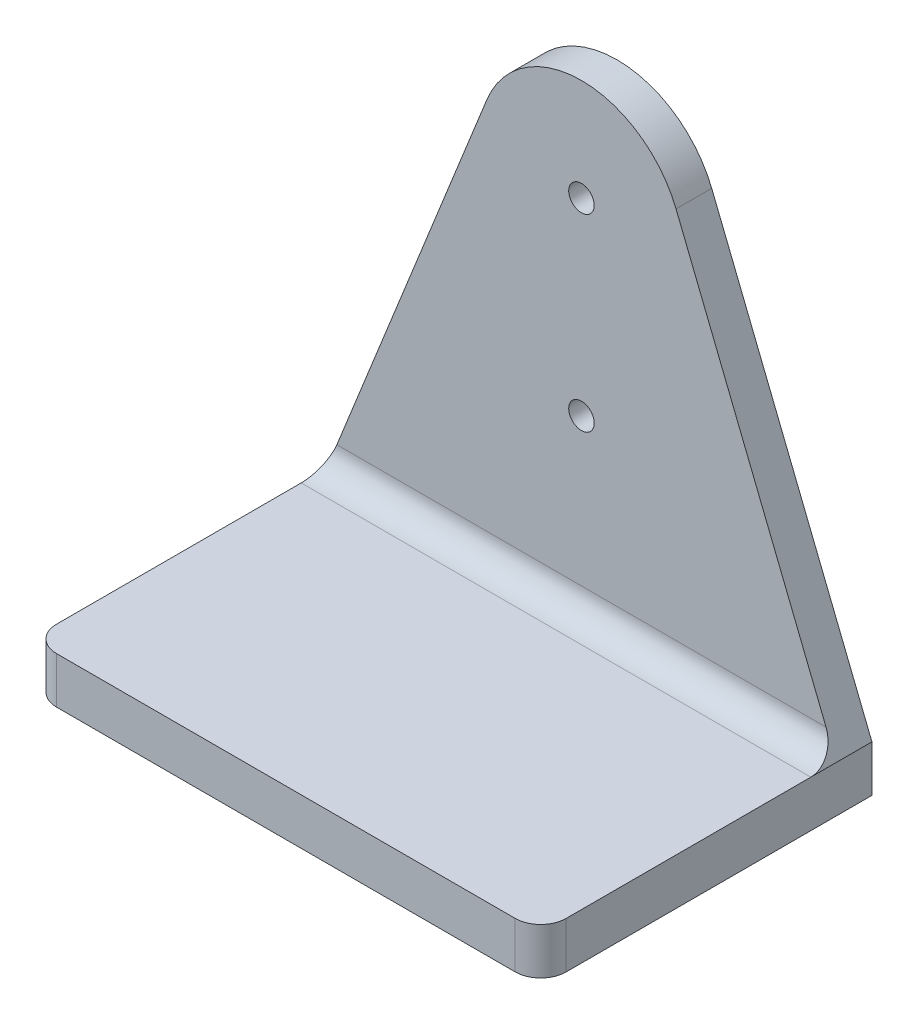
ISO-10303-21;
HEADER;
FILE_DESCRIPTION(('STEP AP214'),'2;1');
FILE_NAME('part.step','',(''),(''),'','','');
FILE_SCHEMA(('AUTOMOTIVE_DESIGN { 1 0 10303 214 1 1 1 1 }'));
ENDSEC;
DATA;
#1=APPLICATION_CONTEXT('core data for automotive mechanical design processes');
#2=APPLICATION_PROTOCOL_DEFINITION('international standard','automotive_design',2000,#1);
#3=PRODUCT_CONTEXT('',#1,'mechanical');
#4=PRODUCT('Part','Part','',(#3));
#5=PRODUCT_RELATED_PRODUCT_CATEGORY('part','',(#4));
#6=PRODUCT_DEFINITION_FORMATION('','',#4);
#7=PRODUCT_DEFINITION_CONTEXT('part definition',#1,'design');
#8=PRODUCT_DEFINITION('design','',#6,#7);
#9=PRODUCT_DEFINITION_SHAPE('','',#8);
#10=(LENGTH_UNIT() NAMED_UNIT(*) SI_UNIT(.MILLI.,.METRE.));
#11=(NAMED_UNIT(*) PLANE_ANGLE_UNIT() SI_UNIT($,.RADIAN.));
#12=(NAMED_UNIT(*) SI_UNIT($,.STERADIAN.) SOLID_ANGLE_UNIT());
#13=UNCERTAINTY_MEASURE_WITH_UNIT(LENGTH_MEASURE(1.E-05),#10,'distance_accuracy_value','');
#14=(GEOMETRIC_REPRESENTATION_CONTEXT(3) GLOBAL_UNCERTAINTY_ASSIGNED_CONTEXT((#13)) GLOBAL_UNIT_ASSIGNED_CONTEXT((#10,
#11,#12)) REPRESENTATION_CONTEXT('',''));
#15=CARTESIAN_POINT('',(0.,0.,0.));
#16=DIRECTION('',(0.,0.,1.));
#17=DIRECTION('',(1.,0.,0.));
#18=AXIS2_PLACEMENT_3D('',#15,#16,#17);
#19=CARTESIAN_POINT('',(50.,9.1,32.5));
#20=DIRECTION('',(0.,1.,0.));
#21=DIRECTION('',(0.,0.,1.));
#22=AXIS2_PLACEMENT_3D('',#19,#20,#21);
#23=PLANE('',#22);
#24=DIRECTION('',(0.,0.,1.));
#25=VECTOR('',#24,1.);
#26=CARTESIAN_POINT('',(-50.,9.1,-32.5));
#27=LINE('',#26,#25);
#28=CARTESIAN_POINT('',(-50.,9.1,-20.5));
#29=VERTEX_POINT('',#28);
#30=CARTESIAN_POINT('',(-50.,9.1,27.5));
#31=VERTEX_POINT('',#30);
#32=EDGE_CURVE('E161',#29,#31,#27,.T.);
#33=ORIENTED_EDGE('',*,*,#32,.T.);
#34=CARTESIAN_POINT('',(-45.,9.1,27.5));
#35=DIRECTION('',(0.,1.,0.));
#36=DIRECTION('',(0.,0.,1.));
#37=AXIS2_PLACEMENT_3D('',#34,#35,#36);
#38=CIRCLE('',#37,5.);
#39=CARTESIAN_POINT('',(-45.,9.1,32.5));
#40=VERTEX_POINT('',#39);
#41=EDGE_CURVE('E44',#31,#40,#38,.T.);
#42=ORIENTED_EDGE('',*,*,#41,.T.);
#43=DIRECTION('',(1.,0.,0.));
#44=VECTOR('',#43,1.);
#45=CARTESIAN_POINT('',(-50.,9.1,32.5));
#46=LINE('',#45,#44);
#47=CARTESIAN_POINT('',(45.,9.1,32.5));
#48=VERTEX_POINT('',#47);
#49=EDGE_CURVE('E166',#40,#48,#46,.T.);
#50=ORIENTED_EDGE('',*,*,#49,.T.);
#51=CARTESIAN_POINT('',(45.,9.1,27.5));
#52=DIRECTION('',(0.,1.,0.));
#53=DIRECTION('',(0.,0.,1.));
#54=AXIS2_PLACEMENT_3D('',#51,#52,#53);
#55=CIRCLE('',#54,5.);
#56=CARTESIAN_POINT('',(50.,9.1,27.5));
#57=VERTEX_POINT('',#56);
#58=EDGE_CURVE('E51',#48,#57,#55,.T.);
#59=ORIENTED_EDGE('',*,*,#58,.T.);
#60=DIRECTION('',(0.,0.,-1.));
#61=VECTOR('',#60,1.);
#62=CARTESIAN_POINT('',(50.,9.1,-32.5));
#63=LINE('',#62,#61);
#64=CARTESIAN_POINT('',(50.,9.1,-20.5));
#65=VERTEX_POINT('',#64);
#66=EDGE_CURVE('E158',#57,#65,#63,.T.);
#67=ORIENTED_EDGE('',*,*,#66,.T.);
#68=DIRECTION('',(-1.,0.,0.));
#69=VECTOR('',#68,1.);
#70=CARTESIAN_POINT('',(50.,9.1,-20.5));
#71=LINE('',#70,#69);
#72=EDGE_CURVE('E208',#65,#29,#71,.T.);
#73=ORIENTED_EDGE('',*,*,#72,.T.);
#74=EDGE_LOOP('',(#33,#42,#50,#59,#67,#73));
#75=FACE_BOUND('',#74,.T.);
#76=ADVANCED_FACE('F36',(#75),#23,.T.);
#77=CARTESIAN_POINT('',(50.,9.1,-32.5));
#78=DIRECTION('',(-1.,0.,0.));
#79=DIRECTION('',(0.,0.,1.));
#80=AXIS2_PLACEMENT_3D('',#77,#78,#79);
#81=PLANE('',#80);
#82=ORIENTED_EDGE('',*,*,#66,.F.);
#83=DIRECTION('',(0.,-1.,0.));
#84=VECTOR('',#83,1.);
#85=CARTESIAN_POINT('',(50.,9.1,27.5));
#86=LINE('',#85,#84);
#87=CARTESIAN_POINT('',(50.,0.,27.5));
#88=VERTEX_POINT('',#87);
#89=EDGE_CURVE('E11',#57,#88,#86,.T.);
#90=ORIENTED_EDGE('',*,*,#89,.T.);
#91=DIRECTION('',(0.,0.,-1.));
#92=VECTOR('',#91,1.);
#93=CARTESIAN_POINT('',(50.,0.,-32.5));
#94=LINE('',#93,#92);
#95=CARTESIAN_POINT('',(50.,0.,-32.5));
#96=VERTEX_POINT('',#95);
#97=EDGE_CURVE('E200',#88,#96,#94,.T.);
#98=ORIENTED_EDGE('',*,*,#97,.T.);
#99=DIRECTION('',(0.,-1.,0.));
#100=VECTOR('',#99,1.);
#101=CARTESIAN_POINT('',(50.,9.1,-32.5));
#102=LINE('',#101,#100);
#103=CARTESIAN_POINT('',(50.,9.1,-32.5));
#104=VERTEX_POINT('',#103);
#105=EDGE_CURVE('E205',#104,#96,#102,.T.);
#106=ORIENTED_EDGE('',*,*,#105,.F.);
#107=DIRECTION('',(0.,0.,-1.));
#108=VECTOR('',#107,1.);
#109=CARTESIAN_POINT('',(50.,9.1,-25.5));
#110=LINE('',#109,#108);
#111=EDGE_CURVE('E151',#65,#104,#110,.T.);
#112=ORIENTED_EDGE('',*,*,#111,.F.);
#113=EDGE_LOOP('',(#82,#90,#98,#106,#112));
#114=FACE_BOUND('',#113,.T.);
#115=ADVANCED_FACE('F235',(#114),#81,.F.);
#116=CARTESIAN_POINT('',(-50.,9.1,-32.5));
#117=DIRECTION('',(0.,0.,1.));
#118=DIRECTION('',(1.,0.,0.));
#119=AXIS2_PLACEMENT_3D('',#116,#117,#118);
#120=PLANE('',#119);
#121=CARTESIAN_POINT('',(0.,80.,-32.5));
#122=DIRECTION('',(0.,0.,1.));
#123=DIRECTION('',(1.,0.,0.));
#124=AXIS2_PLACEMENT_3D('',#121,#122,#123);
#125=CIRCLE('',#124,2.49999999999999);
#126=CARTESIAN_POINT('',(2.49999999999999,80.,-32.5));
#127=VERTEX_POINT('',#126);
#128=EDGE_CURVE('E377',#127,#127,#125,.T.);
#129=ORIENTED_EDGE('',*,*,#128,.T.);
#130=EDGE_LOOP('',(#129));
#131=FACE_BOUND('',#130,.T.);
#132=CARTESIAN_POINT('',(0.,43.,-32.5));
#133=DIRECTION('',(0.,0.,1.));
#134=DIRECTION('',(1.,0.,0.));
#135=AXIS2_PLACEMENT_3D('',#132,#133,#134);
#136=CIRCLE('',#135,2.49999999999999);
#137=CARTESIAN_POINT('',(2.49999999999999,43.,-32.5));
#138=VERTEX_POINT('',#137);
#139=EDGE_CURVE('E144',#138,#138,#136,.T.);
#140=ORIENTED_EDGE('',*,*,#139,.T.);
#141=EDGE_LOOP('',(#140));
#142=FACE_BOUND('',#141,.T.);
#143=DIRECTION('',(-1.,0.,0.));
#144=VECTOR('',#143,1.);
#145=CARTESIAN_POINT('',(-50.,0.,-32.5));
#146=LINE('',#145,#144);
#147=CARTESIAN_POINT('',(-50.,0.,-32.5));
#148=VERTEX_POINT('',#147);
#149=EDGE_CURVE('E197',#96,#148,#146,.T.);
#150=ORIENTED_EDGE('',*,*,#149,.T.);
#151=DIRECTION('',(0.,-1.,0.));
#152=VECTOR('',#151,1.);
#153=CARTESIAN_POINT('',(-50.,9.1,-32.5));
#154=LINE('',#153,#152);
#155=CARTESIAN_POINT('',(-50.,9.1,-32.5));
#156=VERTEX_POINT('',#155);
#157=EDGE_CURVE('E178',#156,#148,#154,.T.);
#158=ORIENTED_EDGE('',*,*,#157,.F.);
#159=DIRECTION('',(0.372405015634342,0.928070312169496,0.));
#160=VECTOR('',#159,1.);
#161=CARTESIAN_POINT('',(-50.,9.1,-32.5));
#162=LINE('',#161,#160);
#163=CARTESIAN_POINT('',(-18.5614062433899,87.4481003126868,-32.5));
#164=VERTEX_POINT('',#163);
#165=EDGE_CURVE('E146',#156,#164,#162,.T.);
#166=ORIENTED_EDGE('',*,*,#165,.T.);
#167=CARTESIAN_POINT('',(0.,80.,-32.5));
#168=DIRECTION('',(0.,0.,-1.));
#169=DIRECTION('',(-1.,0.,0.));
#170=AXIS2_PLACEMENT_3D('',#167,#168,#169);
#171=CIRCLE('',#170,20.);
#172=CARTESIAN_POINT('',(18.5614062433899,87.4481003126868,-32.5));
#173=VERTEX_POINT('',#172);
#174=EDGE_CURVE('E133',#164,#173,#171,.T.);
#175=ORIENTED_EDGE('',*,*,#174,.T.);
#176=DIRECTION('',(0.372405015634342,-0.928070312169496,0.));
#177=VECTOR('',#176,1.);
#178=CARTESIAN_POINT('',(50.,9.1,-32.5));
#179=LINE('',#178,#177);
#180=EDGE_CURVE('E126',#173,#104,#179,.T.);
#181=ORIENTED_EDGE('',*,*,#180,.T.);
#182=ORIENTED_EDGE('',*,*,#105,.T.);
#183=EDGE_LOOP('',(#150,#158,#166,#175,#181,#182));
#184=FACE_BOUND('',#183,.T.);
#185=ADVANCED_FACE('F231',(#131,#142,#184),#120,.F.);
#186=CARTESIAN_POINT('',(-50.,9.1,-32.5));
#187=DIRECTION('',(1.,0.,0.));
#188=DIRECTION('',(0.,0.,-1.));
#189=AXIS2_PLACEMENT_3D('',#186,#187,#188);
#190=PLANE('',#189);
#191=DIRECTION('',(0.,0.,1.));
#192=VECTOR('',#191,1.);
#193=CARTESIAN_POINT('',(-50.,0.,-32.5));
#194=LINE('',#193,#192);
#195=CARTESIAN_POINT('',(-50.,0.,27.5));
#196=VERTEX_POINT('',#195);
#197=EDGE_CURVE('E192',#148,#196,#194,.T.);
#198=ORIENTED_EDGE('',*,*,#197,.T.);
#199=DIRECTION('',(0.,-1.,0.));
#200=VECTOR('',#199,1.);
#201=CARTESIAN_POINT('',(-50.,9.1,27.5));
#202=LINE('',#201,#200);
#203=EDGE_CURVE('E59',#196,#31,#202,.F.);
#204=ORIENTED_EDGE('',*,*,#203,.T.);
#205=ORIENTED_EDGE('',*,*,#32,.F.);
#206=EDGE_CURVE('E179',#156,#29,#27,.T.);
#207=ORIENTED_EDGE('',*,*,#206,.F.);
#208=ORIENTED_EDGE('',*,*,#157,.T.);
#209=EDGE_LOOP('',(#198,#204,#205,#207,#208));
#210=FACE_BOUND('',#209,.T.);
#211=ADVANCED_FACE('F194',(#210),#190,.F.);
#212=CARTESIAN_POINT('',(-50.,9.1,32.5));
#213=DIRECTION('',(0.,0.,-1.));
#214=DIRECTION('',(-1.,0.,0.));
#215=AXIS2_PLACEMENT_3D('',#212,#213,#214);
#216=PLANE('',#215);
#217=ORIENTED_EDGE('',*,*,#49,.F.);
#218=DIRECTION('',(0.,-1.,0.));
#219=VECTOR('',#218,1.);
#220=CARTESIAN_POINT('',(-45.,9.1,32.5));
#221=LINE('',#220,#219);
#222=CARTESIAN_POINT('',(-45.,0.,32.5));
#223=VERTEX_POINT('',#222);
#224=EDGE_CURVE('E174',#40,#223,#221,.T.);
#225=ORIENTED_EDGE('',*,*,#224,.T.);
#226=DIRECTION('',(1.,0.,0.));
#227=VECTOR('',#226,1.);
#228=CARTESIAN_POINT('',(-50.,0.,32.5));
#229=LINE('',#228,#227);
#230=CARTESIAN_POINT('',(45.,0.,32.5));
#231=VERTEX_POINT('',#230);
#232=EDGE_CURVE('E162',#223,#231,#229,.T.);
#233=ORIENTED_EDGE('',*,*,#232,.T.);
#234=DIRECTION('',(0.,-1.,0.));
#235=VECTOR('',#234,1.);
#236=CARTESIAN_POINT('',(45.,9.1,32.5));
#237=LINE('',#236,#235);
#238=EDGE_CURVE('E177',#231,#48,#237,.F.);
#239=ORIENTED_EDGE('',*,*,#238,.T.);
#240=EDGE_LOOP('',(#217,#225,#233,#239));
#241=FACE_BOUND('',#240,.T.);
#242=ADVANCED_FACE('F172',(#241),#216,.F.);
#243=CARTESIAN_POINT('',(50.,0.,32.5));
#244=DIRECTION('',(0.,1.,0.));
#245=DIRECTION('',(0.,0.,1.));
#246=AXIS2_PLACEMENT_3D('',#243,#244,#245);
#247=PLANE('',#246);
#248=ORIENTED_EDGE('',*,*,#232,.F.);
#249=CARTESIAN_POINT('',(-45.,0.,27.5));
#250=DIRECTION('',(0.,1.,0.));
#251=DIRECTION('',(0.,0.,1.));
#252=AXIS2_PLACEMENT_3D('',#249,#250,#251);
#253=CIRCLE('',#252,5.);
#254=EDGE_CURVE('E181',#223,#196,#253,.F.);
#255=ORIENTED_EDGE('',*,*,#254,.T.);
#256=ORIENTED_EDGE('',*,*,#197,.F.);
#257=ORIENTED_EDGE('',*,*,#149,.F.);
#258=ORIENTED_EDGE('',*,*,#97,.F.);
#259=CARTESIAN_POINT('',(45.,0.,27.5));
#260=DIRECTION('',(0.,1.,0.));
#261=DIRECTION('',(0.,0.,1.));
#262=AXIS2_PLACEMENT_3D('',#259,#260,#261);
#263=CIRCLE('',#262,5.);
#264=EDGE_CURVE('E182',#88,#231,#263,.F.);
#265=ORIENTED_EDGE('',*,*,#264,.T.);
#266=EDGE_LOOP('',(#248,#255,#256,#257,#258,#265));
#267=FACE_BOUND('',#266,.T.);
#268=ADVANCED_FACE('F190',(#267),#247,.F.);
#269=CARTESIAN_POINT('',(50.,9.1,-25.5));
#270=DIRECTION('',(0.928070312169496,0.372405015634342,0.));
#271=DIRECTION('',(-0.372405015634342,0.928070312169496,0.));
#272=AXIS2_PLACEMENT_3D('',#269,#270,#271);
#273=PLANE('',#272);
#274=ORIENTED_EDGE('',*,*,#180,.F.);
#275=DIRECTION('',(0.,0.,-1.));
#276=VECTOR('',#275,1.);
#277=CARTESIAN_POINT('',(18.5614062433899,87.4481003126868,-25.5));
#278=LINE('',#277,#276);
#279=CARTESIAN_POINT('',(18.5614062433899,87.4481003126868,-25.5));
#280=VERTEX_POINT('',#279);
#281=EDGE_CURVE('E135',#280,#173,#278,.T.);
#282=ORIENTED_EDGE('',*,*,#281,.F.);
#283=DIRECTION('',(0.372405015634342,-0.928070312169496,0.));
#284=VECTOR('',#283,1.);
#285=CARTESIAN_POINT('',(50.,9.1,-25.5));
#286=LINE('',#285,#284);
#287=CARTESIAN_POINT('',(47.9936594741201,14.1,-25.5));
#288=VERTEX_POINT('',#287);
#289=EDGE_CURVE('E136',#280,#288,#286,.T.);
#290=ORIENTED_EDGE('',*,*,#289,.T.);
#291=CARTESIAN_POINT('',(47.9936594741201,14.1,-20.5));
#292=DIRECTION('',(0.928070312169496,0.372405015634342,0.));
#293=DIRECTION('',(-0.372405015634342,0.928070312169496,0.));
#294=AXIS2_PLACEMENT_3D('',#291,#292,#293);
#295=ELLIPSE('',#294,5.38752283575561,5.);
#296=EDGE_CURVE('E185',#288,#65,#295,.F.);
#297=ORIENTED_EDGE('',*,*,#296,.T.);
#298=ORIENTED_EDGE('',*,*,#111,.T.);
#299=EDGE_LOOP('',(#274,#282,#290,#297,#298));
#300=FACE_BOUND('',#299,.T.);
#301=ADVANCED_FACE('F223',(#300),#273,.T.);
#302=CARTESIAN_POINT('',(0.,80.,-25.5));
#303=DIRECTION('',(0.,0.,-1.));
#304=DIRECTION('',(-1.,0.,0.));
#305=AXIS2_PLACEMENT_3D('',#302,#303,#304);
#306=CYLINDRICAL_SURFACE('',#305,20.);
#307=ORIENTED_EDGE('',*,*,#174,.F.);
#308=DIRECTION('',(0.,0.,-1.));
#309=VECTOR('',#308,1.);
#310=CARTESIAN_POINT('',(-18.5614062433899,87.4481003126868,-25.5));
#311=LINE('',#310,#309);
#312=CARTESIAN_POINT('',(-18.5614062433899,87.4481003126868,-25.5));
#313=VERTEX_POINT('',#312);
#314=EDGE_CURVE('E118',#313,#164,#311,.T.);
#315=ORIENTED_EDGE('',*,*,#314,.F.);
#316=CARTESIAN_POINT('',(0.,80.,-25.5));
#317=DIRECTION('',(0.,0.,-1.));
#318=DIRECTION('',(-1.,0.,0.));
#319=AXIS2_PLACEMENT_3D('',#316,#317,#318);
#320=CIRCLE('',#319,20.);
#321=EDGE_CURVE('E125',#313,#280,#320,.T.);
#322=ORIENTED_EDGE('',*,*,#321,.T.);
#323=ORIENTED_EDGE('',*,*,#281,.T.);
#324=EDGE_LOOP('',(#307,#315,#322,#323));
#325=FACE_BOUND('',#324,.T.);
#326=ADVANCED_FACE('F130',(#325),#306,.T.);
#327=CARTESIAN_POINT('',(-50.,9.1,-25.5));
#328=DIRECTION('',(-0.928070312169496,0.372405015634342,0.));
#329=DIRECTION('',(-0.372405015634342,-0.928070312169496,0.));
#330=AXIS2_PLACEMENT_3D('',#327,#328,#329);
#331=PLANE('',#330);
#332=ORIENTED_EDGE('',*,*,#165,.F.);
#333=ORIENTED_EDGE('',*,*,#206,.T.);
#334=CARTESIAN_POINT('',(-47.9936594741201,14.1,-20.5));
#335=DIRECTION('',(-0.928070312169496,0.372405015634342,0.));
#336=DIRECTION('',(-0.372405015634342,-0.928070312169496,0.));
#337=AXIS2_PLACEMENT_3D('',#334,#335,#336);
#338=ELLIPSE('',#337,5.38752283575561,5.);
#339=CARTESIAN_POINT('',(-47.9936594741201,14.1,-25.5));
#340=VERTEX_POINT('',#339);
#341=EDGE_CURVE('E121',#29,#340,#338,.F.);
#342=ORIENTED_EDGE('',*,*,#341,.T.);
#343=DIRECTION('',(0.372405015634342,0.928070312169496,0.));
#344=VECTOR('',#343,1.);
#345=CARTESIAN_POINT('',(-50.,9.1,-25.5));
#346=LINE('',#345,#344);
#347=EDGE_CURVE('E115',#340,#313,#346,.T.);
#348=ORIENTED_EDGE('',*,*,#347,.T.);
#349=ORIENTED_EDGE('',*,*,#314,.T.);
#350=EDGE_LOOP('',(#332,#333,#342,#348,#349));
#351=FACE_BOUND('',#350,.T.);
#352=ADVANCED_FACE('F117',(#351),#331,.T.);
#353=CARTESIAN_POINT('',(0.,80.,-25.5));
#354=DIRECTION('',(0.,0.,-1.));
#355=DIRECTION('',(-1.,0.,0.));
#356=AXIS2_PLACEMENT_3D('',#353,#354,#355);
#357=PLANE('',#356);
#358=CARTESIAN_POINT('',(0.,80.,-25.5));
#359=DIRECTION('',(0.,0.,1.));
#360=DIRECTION('',(1.,0.,0.));
#361=AXIS2_PLACEMENT_3D('',#358,#359,#360);
#362=CIRCLE('',#361,2.49999999999999);
#363=CARTESIAN_POINT('',(2.49999999999999,80.,-25.5));
#364=VERTEX_POINT('',#363);
#365=EDGE_CURVE('E373',#364,#364,#362,.T.);
#366=ORIENTED_EDGE('',*,*,#365,.F.);
#367=EDGE_LOOP('',(#366));
#368=FACE_BOUND('',#367,.T.);
#369=CARTESIAN_POINT('',(0.,43.,-25.5));
#370=DIRECTION('',(0.,0.,1.));
#371=DIRECTION('',(1.,0.,0.));
#372=AXIS2_PLACEMENT_3D('',#369,#370,#371);
#373=CIRCLE('',#372,2.49999999999999);
#374=CARTESIAN_POINT('',(2.49999999999999,43.,-25.5));
#375=VERTEX_POINT('',#374);
#376=EDGE_CURVE('E376',#375,#375,#373,.T.);
#377=ORIENTED_EDGE('',*,*,#376,.F.);
#378=EDGE_LOOP('',(#377));
#379=FACE_BOUND('',#378,.T.);
#380=ORIENTED_EDGE('',*,*,#347,.F.);
#381=DIRECTION('',(-1.,0.,0.));
#382=VECTOR('',#381,1.);
#383=CARTESIAN_POINT('',(0.,14.1,-25.5));
#384=LINE('',#383,#382);
#385=EDGE_CURVE('E216',#340,#288,#384,.F.);
#386=ORIENTED_EDGE('',*,*,#385,.T.);
#387=ORIENTED_EDGE('',*,*,#289,.F.);
#388=ORIENTED_EDGE('',*,*,#321,.F.);
#389=EDGE_LOOP('',(#380,#386,#387,#388));
#390=FACE_BOUND('',#389,.T.);
#391=ADVANCED_FACE('F138',(#368,#379,#390),#357,.F.);
#392=CARTESIAN_POINT('',(0.,43.,-25.5));
#393=DIRECTION('',(0.,0.,1.));
#394=DIRECTION('',(1.,0.,0.));
#395=AXIS2_PLACEMENT_3D('',#392,#393,#394);
#396=CYLINDRICAL_SURFACE('',#395,2.49999999999999);
#397=ORIENTED_EDGE('',*,*,#376,.T.);
#398=EDGE_LOOP('',(#397));
#399=FACE_BOUND('',#398,.T.);
#400=ORIENTED_EDGE('',*,*,#139,.F.);
#401=EDGE_LOOP('',(#400));
#402=FACE_BOUND('',#401,.T.);
#403=ADVANCED_FACE('F265',(#399,#402),#396,.F.);
#404=CARTESIAN_POINT('',(0.,80.,-25.5));
#405=DIRECTION('',(0.,0.,1.));
#406=DIRECTION('',(1.,0.,0.));
#407=AXIS2_PLACEMENT_3D('',#404,#405,#406);
#408=CYLINDRICAL_SURFACE('',#407,2.49999999999999);
#409=ORIENTED_EDGE('',*,*,#365,.T.);
#410=EDGE_LOOP('',(#409));
#411=FACE_BOUND('',#410,.T.);
#412=ORIENTED_EDGE('',*,*,#128,.F.);
#413=EDGE_LOOP('',(#412));
#414=FACE_BOUND('',#413,.T.);
#415=ADVANCED_FACE('F261',(#411,#414),#408,.F.);
#416=CARTESIAN_POINT('',(50.,14.1,-20.5));
#417=DIRECTION('',(-1.,0.,0.));
#418=DIRECTION('',(0.,0.,1.));
#419=AXIS2_PLACEMENT_3D('',#416,#417,#418);
#420=CYLINDRICAL_SURFACE('',#419,5.);
#421=ORIENTED_EDGE('',*,*,#296,.F.);
#422=ORIENTED_EDGE('',*,*,#385,.F.);
#423=ORIENTED_EDGE('',*,*,#341,.F.);
#424=ORIENTED_EDGE('',*,*,#72,.F.);
#425=EDGE_LOOP('',(#421,#422,#423,#424));
#426=FACE_BOUND('',#425,.T.);
#427=ADVANCED_FACE('F226',(#426),#420,.F.);
#428=CARTESIAN_POINT('',(-45.,9.1,27.5));
#429=DIRECTION('',(0.,-1.,0.));
#430=DIRECTION('',(0.,0.,-1.));
#431=AXIS2_PLACEMENT_3D('',#428,#429,#430);
#432=CYLINDRICAL_SURFACE('',#431,5.);
#433=ORIENTED_EDGE('',*,*,#41,.F.);
#434=ORIENTED_EDGE('',*,*,#203,.F.);
#435=ORIENTED_EDGE('',*,*,#254,.F.);
#436=ORIENTED_EDGE('',*,*,#224,.F.);
#437=EDGE_LOOP('',(#433,#434,#435,#436));
#438=FACE_BOUND('',#437,.T.);
#439=ADVANCED_FACE('F180',(#438),#432,.T.);
#440=CARTESIAN_POINT('',(45.,9.1,27.5));
#441=DIRECTION('',(0.,-1.,0.));
#442=DIRECTION('',(0.,0.,-1.));
#443=AXIS2_PLACEMENT_3D('',#440,#441,#442);
#444=CYLINDRICAL_SURFACE('',#443,5.);
#445=ORIENTED_EDGE('',*,*,#58,.F.);
#446=ORIENTED_EDGE('',*,*,#238,.F.);
#447=ORIENTED_EDGE('',*,*,#264,.F.);
#448=ORIENTED_EDGE('',*,*,#89,.F.);
#449=EDGE_LOOP('',(#445,#446,#447,#448));
#450=FACE_BOUND('',#449,.T.);
#451=ADVANCED_FACE('F38',(#450),#444,.T.);
#452=CLOSED_SHELL('',(#76,#115,#185,#211,#242,#268,#301,#326,#352,#391,#403,#415,#427,#439,#451));
#453=MANIFOLD_SOLID_BREP('B2',#452);
#454=ADVANCED_BREP_SHAPE_REPRESENTATION('',(#18,#453),#14);
#455=SHAPE_DEFINITION_REPRESENTATION(#9,#454);
ENDSEC;
END-ISO-10303-21;
